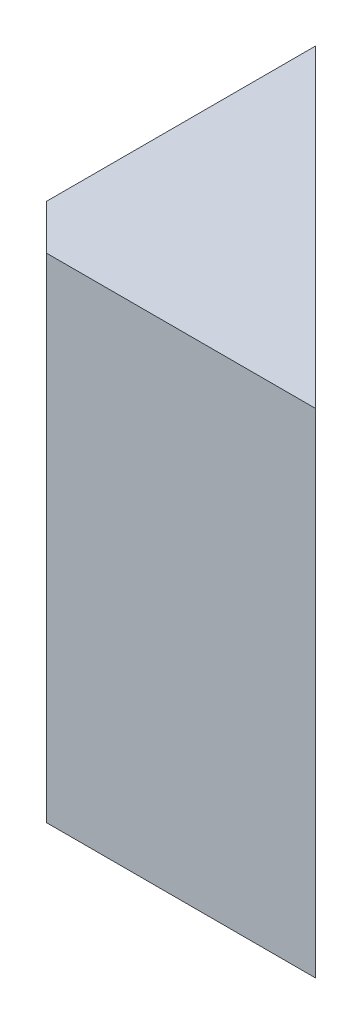
ISO-10303-21;
HEADER;
FILE_DESCRIPTION(('STEP AP214'),'2;1');
FILE_NAME('part.step','',(''),(''),'','','');
FILE_SCHEMA(('AUTOMOTIVE_DESIGN { 1 0 10303 214 1 1 1 1 }'));
ENDSEC;
DATA;
#1=APPLICATION_CONTEXT('core data for automotive mechanical design processes');
#2=APPLICATION_PROTOCOL_DEFINITION('international standard','automotive_design',2000,#1);
#3=PRODUCT_CONTEXT('',#1,'mechanical');
#4=PRODUCT('Part','Part','',(#3));
#5=PRODUCT_RELATED_PRODUCT_CATEGORY('part','',(#4));
#6=PRODUCT_DEFINITION_FORMATION('','',#4);
#7=PRODUCT_DEFINITION_CONTEXT('part definition',#1,'design');
#8=PRODUCT_DEFINITION('design','',#6,#7);
#9=PRODUCT_DEFINITION_SHAPE('','',#8);
#10=(LENGTH_UNIT() NAMED_UNIT(*) SI_UNIT(.MILLI.,.METRE.));
#11=(NAMED_UNIT(*) PLANE_ANGLE_UNIT() SI_UNIT($,.RADIAN.));
#12=(NAMED_UNIT(*) SI_UNIT($,.STERADIAN.) SOLID_ANGLE_UNIT());
#13=UNCERTAINTY_MEASURE_WITH_UNIT(LENGTH_MEASURE(1.E-05),#10,'distance_accuracy_value','');
#14=(GEOMETRIC_REPRESENTATION_CONTEXT(3) GLOBAL_UNCERTAINTY_ASSIGNED_CONTEXT((#13)) GLOBAL_UNIT_ASSIGNED_CONTEXT((#10,
#11,#12)) REPRESENTATION_CONTEXT('',''));
#15=CARTESIAN_POINT('',(0.,0.,0.));
#16=DIRECTION('',(0.,0.,1.));
#17=DIRECTION('',(1.,0.,0.));
#18=AXIS2_PLACEMENT_3D('',#15,#16,#17);
#19=CARTESIAN_POINT('',(0.,0.55,0.));
#20=DIRECTION('',(0.707106781186548,0.,-0.707106781186547));
#21=DIRECTION('',(-0.707106781186547,0.,-0.707106781186548));
#22=AXIS2_PLACEMENT_3D('',#19,#20,#21);
#23=PLANE('',#22);
#24=DIRECTION('',(0.707106781186547,0.,0.707106781186548));
#25=VECTOR('',#24,1.);
#26=CARTESIAN_POINT('',(0.,0.,0.));
#27=LINE('',#26,#25);
#28=CARTESIAN_POINT('',(0.,0.,0.));
#29=VERTEX_POINT('',#28);
#30=CARTESIAN_POINT('',(0.0499999999999994,0.,0.0499999999999995));
#31=VERTEX_POINT('',#30);
#32=EDGE_CURVE('E117',#29,#31,#27,.T.);
#33=ORIENTED_EDGE('',*,*,#32,.T.);
#34=DIRECTION('',(0.,-1.,0.));
#35=VECTOR('',#34,1.);
#36=CARTESIAN_POINT('',(0.0499999999999994,0.55,0.0499999999999995));
#37=LINE('',#36,#35);
#38=CARTESIAN_POINT('',(0.0499999999999994,0.55,0.0499999999999995));
#39=VERTEX_POINT('',#38);
#40=EDGE_CURVE('E11',#39,#31,#37,.T.);
#41=ORIENTED_EDGE('',*,*,#40,.F.);
#42=DIRECTION('',(0.707106781186547,0.,0.707106781186548));
#43=VECTOR('',#42,1.);
#44=CARTESIAN_POINT('',(0.,0.55,0.));
#45=LINE('',#44,#43);
#46=CARTESIAN_POINT('',(0.,0.55,0.));
#47=VERTEX_POINT('',#46);
#48=EDGE_CURVE('E101',#47,#39,#45,.T.);
#49=ORIENTED_EDGE('',*,*,#48,.F.);
#50=DIRECTION('',(0.,-1.,0.));
#51=VECTOR('',#50,1.);
#52=CARTESIAN_POINT('',(0.,0.55,0.));
#53=LINE('',#52,#51);
#54=EDGE_CURVE('E113',#47,#29,#53,.T.);
#55=ORIENTED_EDGE('',*,*,#54,.T.);
#56=EDGE_LOOP('',(#33,#41,#49,#55));
#57=FACE_BOUND('',#56,.T.);
#58=ADVANCED_FACE('F41',(#57),#23,.F.);
#59=CARTESIAN_POINT('',(0.0499999999999994,0.55,0.0499999999999995));
#60=DIRECTION('',(0.,0.,-1.));
#61=DIRECTION('',(-1.,0.,0.));
#62=AXIS2_PLACEMENT_3D('',#59,#60,#61);
#63=PLANE('',#62);
#64=DIRECTION('',(1.,0.,0.));
#65=VECTOR('',#64,1.);
#66=CARTESIAN_POINT('',(0.0499999999999994,0.,0.0499999999999995));
#67=LINE('',#66,#65);
#68=CARTESIAN_POINT('',(0.349999999999999,0.,0.0500000000000005));
#69=VERTEX_POINT('',#68);
#70=EDGE_CURVE('E106',#31,#69,#67,.T.);
#71=ORIENTED_EDGE('',*,*,#70,.T.);
#72=DIRECTION('',(0.,-1.,0.));
#73=VECTOR('',#72,1.);
#74=CARTESIAN_POINT('',(0.349999999999999,0.55,0.0500000000000005));
#75=LINE('',#74,#73);
#76=CARTESIAN_POINT('',(0.349999999999999,0.55,0.0500000000000005));
#77=VERTEX_POINT('',#76);
#78=EDGE_CURVE('E50',#77,#69,#75,.T.);
#79=ORIENTED_EDGE('',*,*,#78,.F.);
#80=DIRECTION('',(1.,0.,0.));
#81=VECTOR('',#80,1.);
#82=CARTESIAN_POINT('',(0.0499999999999994,0.55,0.0499999999999995));
#83=LINE('',#82,#81);
#84=EDGE_CURVE('E95',#39,#77,#83,.T.);
#85=ORIENTED_EDGE('',*,*,#84,.F.);
#86=ORIENTED_EDGE('',*,*,#40,.T.);
#87=EDGE_LOOP('',(#71,#79,#85,#86));
#88=FACE_BOUND('',#87,.T.);
#89=ADVANCED_FACE('F105',(#88),#63,.F.);
#90=CARTESIAN_POINT('',(0.,0.55,-0.3));
#91=DIRECTION('',(-0.707106781186549,0.,0.707106781186547));
#92=DIRECTION('',(0.707106781186547,0.,0.707106781186549));
#93=AXIS2_PLACEMENT_3D('',#90,#91,#92);
#94=PLANE('',#93);
#95=DIRECTION('',(-0.707106781186546,0.,-0.707106781186548));
#96=VECTOR('',#95,1.);
#97=CARTESIAN_POINT('',(0.,0.,-0.3));
#98=LINE('',#97,#96);
#99=CARTESIAN_POINT('',(0.,0.,-0.3));
#100=VERTEX_POINT('',#99);
#101=EDGE_CURVE('E81',#69,#100,#98,.T.);
#102=ORIENTED_EDGE('',*,*,#101,.T.);
#103=DIRECTION('',(0.,-1.,0.));
#104=VECTOR('',#103,1.);
#105=CARTESIAN_POINT('',(0.,0.55,-0.3));
#106=LINE('',#105,#104);
#107=CARTESIAN_POINT('',(0.,0.55,-0.3));
#108=VERTEX_POINT('',#107);
#109=EDGE_CURVE('E108',#108,#100,#106,.T.);
#110=ORIENTED_EDGE('',*,*,#109,.F.);
#111=DIRECTION('',(-0.707106781186546,0.,-0.707106781186548));
#112=VECTOR('',#111,1.);
#113=CARTESIAN_POINT('',(0.,0.55,-0.3));
#114=LINE('',#113,#112);
#115=EDGE_CURVE('E99',#77,#108,#114,.T.);
#116=ORIENTED_EDGE('',*,*,#115,.F.);
#117=ORIENTED_EDGE('',*,*,#78,.T.);
#118=EDGE_LOOP('',(#102,#110,#116,#117));
#119=FACE_BOUND('',#118,.T.);
#120=ADVANCED_FACE('F109',(#119),#94,.F.);
#121=CARTESIAN_POINT('',(0.,0.55,0.));
#122=DIRECTION('',(1.,0.,0.));
#123=DIRECTION('',(0.,0.,-1.));
#124=AXIS2_PLACEMENT_3D('',#121,#122,#123);
#125=PLANE('',#124);
#126=DIRECTION('',(0.,0.,1.));
#127=VECTOR('',#126,1.);
#128=CARTESIAN_POINT('',(0.,0.,0.));
#129=LINE('',#128,#127);
#130=EDGE_CURVE('E87',#100,#29,#129,.T.);
#131=ORIENTED_EDGE('',*,*,#130,.T.);
#132=ORIENTED_EDGE('',*,*,#54,.F.);
#133=DIRECTION('',(0.,0.,1.));
#134=VECTOR('',#133,1.);
#135=CARTESIAN_POINT('',(0.,0.55,0.));
#136=LINE('',#135,#134);
#137=EDGE_CURVE('E61',#108,#47,#136,.T.);
#138=ORIENTED_EDGE('',*,*,#137,.F.);
#139=ORIENTED_EDGE('',*,*,#109,.T.);
#140=EDGE_LOOP('',(#131,#132,#138,#139));
#141=FACE_BOUND('',#140,.T.);
#142=ADVANCED_FACE('F131',(#141),#125,.F.);
#143=CARTESIAN_POINT('',(0.,0.55,0.));
#144=DIRECTION('',(0.,1.,0.));
#145=DIRECTION('',(0.,0.,1.));
#146=AXIS2_PLACEMENT_3D('',#143,#144,#145);
#147=PLANE('',#146);
#148=ORIENTED_EDGE('',*,*,#48,.T.);
#149=ORIENTED_EDGE('',*,*,#84,.T.);
#150=ORIENTED_EDGE('',*,*,#115,.T.);
#151=ORIENTED_EDGE('',*,*,#137,.T.);
#152=EDGE_LOOP('',(#148,#149,#150,#151));
#153=FACE_BOUND('',#152,.T.);
#154=ADVANCED_FACE('F97',(#153),#147,.T.);
#155=CARTESIAN_POINT('',(0.,0.,0.));
#156=DIRECTION('',(0.,1.,0.));
#157=DIRECTION('',(0.,0.,1.));
#158=AXIS2_PLACEMENT_3D('',#155,#156,#157);
#159=PLANE('',#158);
#160=ORIENTED_EDGE('',*,*,#32,.F.);
#161=ORIENTED_EDGE('',*,*,#130,.F.);
#162=ORIENTED_EDGE('',*,*,#101,.F.);
#163=ORIENTED_EDGE('',*,*,#70,.F.);
#164=EDGE_LOOP('',(#160,#161,#162,#163));
#165=FACE_BOUND('',#164,.T.);
#166=ADVANCED_FACE('F134',(#165),#159,.F.);
#167=CLOSED_SHELL('',(#58,#89,#120,#142,#154,#166));
#168=MANIFOLD_SOLID_BREP('B2',#167);
#169=ADVANCED_BREP_SHAPE_REPRESENTATION('',(#18,#168),#14);
#170=SHAPE_DEFINITION_REPRESENTATION(#9,#169);
ENDSEC;
END-ISO-10303-21;
